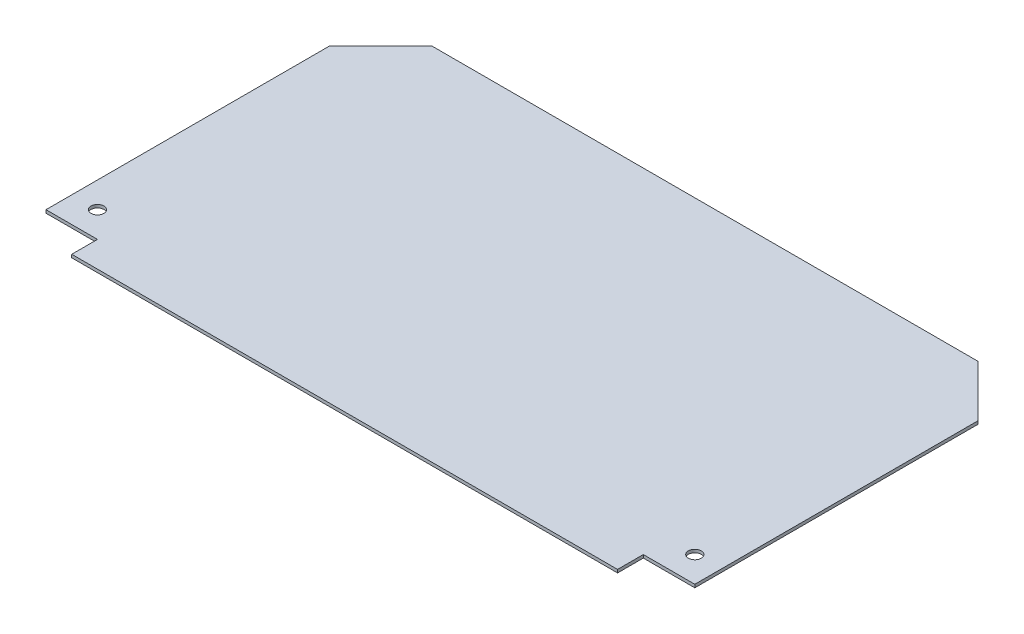
ISO-10303-21;
HEADER;
FILE_DESCRIPTION(('STEP AP214'),'2;1');
FILE_NAME('part.step','',(''),(''),'','','');
FILE_SCHEMA(('AUTOMOTIVE_DESIGN { 1 0 10303 214 1 1 1 1 }'));
ENDSEC;
DATA;
#1=APPLICATION_CONTEXT('core data for automotive mechanical design processes');
#2=APPLICATION_PROTOCOL_DEFINITION('international standard','automotive_design',2000,#1);
#3=PRODUCT_CONTEXT('',#1,'mechanical');
#4=PRODUCT('Part','Part','',(#3));
#5=PRODUCT_RELATED_PRODUCT_CATEGORY('part','',(#4));
#6=PRODUCT_DEFINITION_FORMATION('','',#4);
#7=PRODUCT_DEFINITION_CONTEXT('part definition',#1,'design');
#8=PRODUCT_DEFINITION('design','',#6,#7);
#9=PRODUCT_DEFINITION_SHAPE('','',#8);
#10=(LENGTH_UNIT() NAMED_UNIT(*) SI_UNIT(.MILLI.,.METRE.));
#11=(NAMED_UNIT(*) PLANE_ANGLE_UNIT() SI_UNIT($,.RADIAN.));
#12=(NAMED_UNIT(*) SI_UNIT($,.STERADIAN.) SOLID_ANGLE_UNIT());
#13=UNCERTAINTY_MEASURE_WITH_UNIT(LENGTH_MEASURE(1.E-05),#10,'distance_accuracy_value','');
#14=(GEOMETRIC_REPRESENTATION_CONTEXT(3) GLOBAL_UNCERTAINTY_ASSIGNED_CONTEXT((#13)) GLOBAL_UNIT_ASSIGNED_CONTEXT((#10,
#11,#12)) REPRESENTATION_CONTEXT('',''));
#15=CARTESIAN_POINT('',(0.,0.,0.));
#16=DIRECTION('',(0.,0.,1.));
#17=DIRECTION('',(1.,0.,0.));
#18=AXIS2_PLACEMENT_3D('',#15,#16,#17);
#19=CARTESIAN_POINT('',(-126.,-1.2,-110.));
#20=DIRECTION('',(-1.,0.,0.));
#21=DIRECTION('',(0.,0.,1.));
#22=AXIS2_PLACEMENT_3D('',#19,#20,#21);
#23=PLANE('',#22);
#24=DIRECTION('',(0.,0.,1.));
#25=VECTOR('',#24,1.);
#26=CARTESIAN_POINT('',(-126.,0.,-110.));
#27=LINE('',#26,#25);
#28=CARTESIAN_POINT('',(-126.,0.,-110.));
#29=VERTEX_POINT('',#28);
#30=CARTESIAN_POINT('',(-126.,0.,0.));
#31=VERTEX_POINT('',#30);
#32=EDGE_CURVE('E137',#29,#31,#27,.T.);
#33=ORIENTED_EDGE('',*,*,#32,.F.);
#34=DIRECTION('',(0.,1.,0.));
#35=VECTOR('',#34,1.);
#36=CARTESIAN_POINT('',(-126.,-1.2,-110.));
#37=LINE('',#36,#35);
#38=CARTESIAN_POINT('',(-126.,-1.2,-110.));
#39=VERTEX_POINT('',#38);
#40=EDGE_CURVE('E11',#39,#29,#37,.T.);
#41=ORIENTED_EDGE('',*,*,#40,.F.);
#42=DIRECTION('',(0.,0.,1.));
#43=VECTOR('',#42,1.);
#44=CARTESIAN_POINT('',(-126.,-1.2,-110.));
#45=LINE('',#44,#43);
#46=CARTESIAN_POINT('',(-126.,-1.2,0.));
#47=VERTEX_POINT('',#46);
#48=EDGE_CURVE('E130',#39,#47,#45,.T.);
#49=ORIENTED_EDGE('',*,*,#48,.T.);
#50=DIRECTION('',(0.,1.,0.));
#51=VECTOR('',#50,1.);
#52=CARTESIAN_POINT('',(-126.,-1.2,0.));
#53=LINE('',#52,#51);
#54=EDGE_CURVE('E46',#47,#31,#53,.T.);
#55=ORIENTED_EDGE('',*,*,#54,.T.);
#56=EDGE_LOOP('',(#33,#41,#49,#55));
#57=FACE_BOUND('',#56,.T.);
#58=ADVANCED_FACE('F43',(#57),#23,.T.);
#59=CARTESIAN_POINT('',(-106.,-1.2,-130.));
#60=DIRECTION('',(-0.707106781186549,0.,-0.707106781186546));
#61=DIRECTION('',(-0.707106781186546,0.,0.707106781186549));
#62=AXIS2_PLACEMENT_3D('',#59,#60,#61);
#63=PLANE('',#62);
#64=DIRECTION('',(-0.707106781186546,0.,0.707106781186549));
#65=VECTOR('',#64,1.);
#66=CARTESIAN_POINT('',(-106.,0.,-130.));
#67=LINE('',#66,#65);
#68=CARTESIAN_POINT('',(-106.,0.,-130.));
#69=VERTEX_POINT('',#68);
#70=EDGE_CURVE('E149',#69,#29,#67,.T.);
#71=ORIENTED_EDGE('',*,*,#70,.F.);
#72=DIRECTION('',(0.,1.,0.));
#73=VECTOR('',#72,1.);
#74=CARTESIAN_POINT('',(-106.,-1.2,-130.));
#75=LINE('',#74,#73);
#76=CARTESIAN_POINT('',(-106.,-1.2,-130.));
#77=VERTEX_POINT('',#76);
#78=EDGE_CURVE('E52',#77,#69,#75,.T.);
#79=ORIENTED_EDGE('',*,*,#78,.F.);
#80=DIRECTION('',(-0.707106781186546,0.,0.707106781186549));
#81=VECTOR('',#80,1.);
#82=CARTESIAN_POINT('',(-106.,-1.2,-130.));
#83=LINE('',#82,#81);
#84=EDGE_CURVE('E135',#77,#39,#83,.T.);
#85=ORIENTED_EDGE('',*,*,#84,.T.);
#86=ORIENTED_EDGE('',*,*,#40,.T.);
#87=EDGE_LOOP('',(#71,#79,#85,#86));
#88=FACE_BOUND('',#87,.T.);
#89=ADVANCED_FACE('F157',(#88),#63,.T.);
#90=CARTESIAN_POINT('',(0.,-1.2,-130.));
#91=DIRECTION('',(0.,0.,-1.));
#92=DIRECTION('',(-1.,0.,0.));
#93=AXIS2_PLACEMENT_3D('',#90,#91,#92);
#94=PLANE('',#93);
#95=DIRECTION('',(-1.,0.,0.));
#96=VECTOR('',#95,1.);
#97=CARTESIAN_POINT('',(0.,0.,-130.));
#98=LINE('',#97,#96);
#99=CARTESIAN_POINT('',(106.,0.,-130.));
#100=VERTEX_POINT('',#99);
#101=EDGE_CURVE('E147',#100,#69,#98,.T.);
#102=ORIENTED_EDGE('',*,*,#101,.F.);
#103=DIRECTION('',(0.,1.,0.));
#104=VECTOR('',#103,1.);
#105=CARTESIAN_POINT('',(106.,-1.2,-130.));
#106=LINE('',#105,#104);
#107=CARTESIAN_POINT('',(106.,-1.2,-130.));
#108=VERTEX_POINT('',#107);
#109=EDGE_CURVE('E164',#108,#100,#106,.T.);
#110=ORIENTED_EDGE('',*,*,#109,.F.);
#111=DIRECTION('',(-1.,0.,0.));
#112=VECTOR('',#111,1.);
#113=CARTESIAN_POINT('',(0.,-1.2,-130.));
#114=LINE('',#113,#112);
#115=EDGE_CURVE('E125',#108,#77,#114,.T.);
#116=ORIENTED_EDGE('',*,*,#115,.T.);
#117=ORIENTED_EDGE('',*,*,#78,.T.);
#118=EDGE_LOOP('',(#102,#110,#116,#117));
#119=FACE_BOUND('',#118,.T.);
#120=ADVANCED_FACE('F161',(#119),#94,.T.);
#121=CARTESIAN_POINT('',(-106.,-1.2,10.));
#122=DIRECTION('',(0.,0.,1.));
#123=DIRECTION('',(1.,0.,0.));
#124=AXIS2_PLACEMENT_3D('',#121,#122,#123);
#125=PLANE('',#124);
#126=DIRECTION('',(1.,0.,0.));
#127=VECTOR('',#126,1.);
#128=CARTESIAN_POINT('',(-106.,0.,10.));
#129=LINE('',#128,#127);
#130=CARTESIAN_POINT('',(-106.,0.,10.));
#131=VERTEX_POINT('',#130);
#132=CARTESIAN_POINT('',(106.,0.,10.));
#133=VERTEX_POINT('',#132);
#134=EDGE_CURVE('E109',#131,#133,#129,.T.);
#135=ORIENTED_EDGE('',*,*,#134,.F.);
#136=DIRECTION('',(0.,1.,0.));
#137=VECTOR('',#136,1.);
#138=CARTESIAN_POINT('',(-106.,-1.2,10.));
#139=LINE('',#138,#137);
#140=CARTESIAN_POINT('',(-106.,-1.2,10.));
#141=VERTEX_POINT('',#140);
#142=EDGE_CURVE('E101',#141,#131,#139,.T.);
#143=ORIENTED_EDGE('',*,*,#142,.F.);
#144=DIRECTION('',(1.,0.,0.));
#145=VECTOR('',#144,1.);
#146=CARTESIAN_POINT('',(-106.,-1.2,10.));
#147=LINE('',#146,#145);
#148=CARTESIAN_POINT('',(106.,-1.2,10.));
#149=VERTEX_POINT('',#148);
#150=EDGE_CURVE('E106',#141,#149,#147,.T.);
#151=ORIENTED_EDGE('',*,*,#150,.T.);
#152=DIRECTION('',(0.,1.,0.));
#153=VECTOR('',#152,1.);
#154=CARTESIAN_POINT('',(106.,-1.2,10.));
#155=LINE('',#154,#153);
#156=EDGE_CURVE('E181',#149,#133,#155,.T.);
#157=ORIENTED_EDGE('',*,*,#156,.T.);
#158=EDGE_LOOP('',(#135,#143,#151,#157));
#159=FACE_BOUND('',#158,.T.);
#160=ADVANCED_FACE('F103',(#159),#125,.T.);
#161=CARTESIAN_POINT('',(-106.,-1.2,0.));
#162=DIRECTION('',(-1.,0.,0.));
#163=DIRECTION('',(0.,0.,1.));
#164=AXIS2_PLACEMENT_3D('',#161,#162,#163);
#165=PLANE('',#164);
#166=DIRECTION('',(0.,0.,1.));
#167=VECTOR('',#166,1.);
#168=CARTESIAN_POINT('',(-106.,0.,0.));
#169=LINE('',#168,#167);
#170=CARTESIAN_POINT('',(-106.,0.,0.));
#171=VERTEX_POINT('',#170);
#172=EDGE_CURVE('E144',#171,#131,#169,.T.);
#173=ORIENTED_EDGE('',*,*,#172,.F.);
#174=DIRECTION('',(0.,1.,0.));
#175=VECTOR('',#174,1.);
#176=CARTESIAN_POINT('',(-106.,-1.2,0.));
#177=LINE('',#176,#175);
#178=CARTESIAN_POINT('',(-106.,-1.2,0.));
#179=VERTEX_POINT('',#178);
#180=EDGE_CURVE('E114',#179,#171,#177,.T.);
#181=ORIENTED_EDGE('',*,*,#180,.F.);
#182=DIRECTION('',(0.,0.,1.));
#183=VECTOR('',#182,1.);
#184=CARTESIAN_POINT('',(-106.,-1.2,0.));
#185=LINE('',#184,#183);
#186=EDGE_CURVE('E120',#179,#141,#185,.T.);
#187=ORIENTED_EDGE('',*,*,#186,.T.);
#188=ORIENTED_EDGE('',*,*,#142,.T.);
#189=EDGE_LOOP('',(#173,#181,#187,#188));
#190=FACE_BOUND('',#189,.T.);
#191=ADVANCED_FACE('F127',(#190),#165,.T.);
#192=CARTESIAN_POINT('',(-126.,-1.2,0.));
#193=DIRECTION('',(0.,0.,1.));
#194=DIRECTION('',(1.,0.,0.));
#195=AXIS2_PLACEMENT_3D('',#192,#193,#194);
#196=PLANE('',#195);
#197=DIRECTION('',(1.,0.,0.));
#198=VECTOR('',#197,1.);
#199=CARTESIAN_POINT('',(-126.,0.,0.));
#200=LINE('',#199,#198);
#201=EDGE_CURVE('E140',#31,#171,#200,.T.);
#202=ORIENTED_EDGE('',*,*,#201,.F.);
#203=ORIENTED_EDGE('',*,*,#54,.F.);
#204=DIRECTION('',(1.,0.,0.));
#205=VECTOR('',#204,1.);
#206=CARTESIAN_POINT('',(-126.,-1.2,0.));
#207=LINE('',#206,#205);
#208=EDGE_CURVE('E128',#47,#179,#207,.T.);
#209=ORIENTED_EDGE('',*,*,#208,.T.);
#210=ORIENTED_EDGE('',*,*,#180,.T.);
#211=EDGE_LOOP('',(#202,#203,#209,#210));
#212=FACE_BOUND('',#211,.T.);
#213=ADVANCED_FACE('F152',(#212),#196,.T.);
#214=CARTESIAN_POINT('',(0.,-1.2,0.));
#215=DIRECTION('',(0.,1.,0.));
#216=DIRECTION('',(0.,0.,1.));
#217=AXIS2_PLACEMENT_3D('',#214,#215,#216);
#218=PLANE('',#217);
#219=CARTESIAN_POINT('',(-116.,-1.2,-10.));
#220=DIRECTION('',(0.,1.,0.));
#221=DIRECTION('',(0.,0.,1.));
#222=AXIS2_PLACEMENT_3D('',#219,#220,#221);
#223=CIRCLE('',#222,2.50000000000001);
#224=CARTESIAN_POINT('',(-116.,-1.2,-7.49999999999999));
#225=VERTEX_POINT('',#224);
#226=EDGE_CURVE('E141',#225,#225,#223,.T.);
#227=ORIENTED_EDGE('',*,*,#226,.T.);
#228=EDGE_LOOP('',(#227));
#229=FACE_BOUND('',#228,.T.);
#230=ORIENTED_EDGE('',*,*,#48,.F.);
#231=ORIENTED_EDGE('',*,*,#84,.F.);
#232=ORIENTED_EDGE('',*,*,#115,.F.);
#233=DIRECTION('',(0.707106781186546,0.,0.707106781186549));
#234=VECTOR('',#233,1.);
#235=CARTESIAN_POINT('',(106.,-1.2,-130.));
#236=LINE('',#235,#234);
#237=CARTESIAN_POINT('',(126.,-1.2,-110.));
#238=VERTEX_POINT('',#237);
#239=EDGE_CURVE('E178',#108,#238,#236,.T.);
#240=ORIENTED_EDGE('',*,*,#239,.T.);
#241=DIRECTION('',(0.,0.,1.));
#242=VECTOR('',#241,1.);
#243=CARTESIAN_POINT('',(126.,-1.2,-110.));
#244=LINE('',#243,#242);
#245=CARTESIAN_POINT('',(126.,-1.2,0.));
#246=VERTEX_POINT('',#245);
#247=EDGE_CURVE('E189',#238,#246,#244,.T.);
#248=ORIENTED_EDGE('',*,*,#247,.T.);
#249=DIRECTION('',(-1.,0.,0.));
#250=VECTOR('',#249,1.);
#251=CARTESIAN_POINT('',(126.,-1.2,0.));
#252=LINE('',#251,#250);
#253=CARTESIAN_POINT('',(106.,-1.2,0.));
#254=VERTEX_POINT('',#253);
#255=EDGE_CURVE('E202',#246,#254,#252,.T.);
#256=ORIENTED_EDGE('',*,*,#255,.T.);
#257=DIRECTION('',(0.,0.,1.));
#258=VECTOR('',#257,1.);
#259=CARTESIAN_POINT('',(106.,-1.2,0.));
#260=LINE('',#259,#258);
#261=EDGE_CURVE('E123',#254,#149,#260,.T.);
#262=ORIENTED_EDGE('',*,*,#261,.T.);
#263=ORIENTED_EDGE('',*,*,#150,.F.);
#264=ORIENTED_EDGE('',*,*,#186,.F.);
#265=ORIENTED_EDGE('',*,*,#208,.F.);
#266=EDGE_LOOP('',(#230,#231,#232,#240,#248,#256,#262,#263,#264,#265));
#267=FACE_BOUND('',#266,.T.);
#268=CARTESIAN_POINT('',(116.,-1.2,-10.));
#269=DIRECTION('',(0.,-1.,0.));
#270=DIRECTION('',(0.,0.,1.));
#271=AXIS2_PLACEMENT_3D('',#268,#269,#270);
#272=CIRCLE('',#271,2.50000000000001);
#273=CARTESIAN_POINT('',(116.,-1.2,-7.49999999999999));
#274=VERTEX_POINT('',#273);
#275=EDGE_CURVE('E199',#274,#274,#272,.T.);
#276=ORIENTED_EDGE('',*,*,#275,.F.);
#277=EDGE_LOOP('',(#276));
#278=FACE_BOUND('',#277,.T.);
#279=ADVANCED_FACE('F118',(#229,#267,#278),#218,.F.);
#280=CARTESIAN_POINT('',(0.,0.,0.));
#281=DIRECTION('',(0.,1.,0.));
#282=DIRECTION('',(0.,0.,1.));
#283=AXIS2_PLACEMENT_3D('',#280,#281,#282);
#284=PLANE('',#283);
#285=CARTESIAN_POINT('',(-116.,0.,-10.));
#286=DIRECTION('',(0.,1.,0.));
#287=DIRECTION('',(0.,0.,1.));
#288=AXIS2_PLACEMENT_3D('',#285,#286,#287);
#289=CIRCLE('',#288,2.50000000000001);
#290=CARTESIAN_POINT('',(-116.,0.,-7.49999999999999));
#291=VERTEX_POINT('',#290);
#292=EDGE_CURVE('E168',#291,#291,#289,.T.);
#293=ORIENTED_EDGE('',*,*,#292,.F.);
#294=EDGE_LOOP('',(#293));
#295=FACE_BOUND('',#294,.T.);
#296=ORIENTED_EDGE('',*,*,#32,.T.);
#297=ORIENTED_EDGE('',*,*,#201,.T.);
#298=ORIENTED_EDGE('',*,*,#172,.T.);
#299=ORIENTED_EDGE('',*,*,#134,.T.);
#300=DIRECTION('',(0.,0.,1.));
#301=VECTOR('',#300,1.);
#302=CARTESIAN_POINT('',(106.,0.,0.));
#303=LINE('',#302,#301);
#304=CARTESIAN_POINT('',(106.,0.,0.));
#305=VERTEX_POINT('',#304);
#306=EDGE_CURVE('E190',#305,#133,#303,.T.);
#307=ORIENTED_EDGE('',*,*,#306,.F.);
#308=DIRECTION('',(-1.,0.,0.));
#309=VECTOR('',#308,1.);
#310=CARTESIAN_POINT('',(126.,0.,0.));
#311=LINE('',#310,#309);
#312=CARTESIAN_POINT('',(126.,0.,0.));
#313=VERTEX_POINT('',#312);
#314=EDGE_CURVE('E193',#313,#305,#311,.T.);
#315=ORIENTED_EDGE('',*,*,#314,.F.);
#316=DIRECTION('',(0.,0.,1.));
#317=VECTOR('',#316,1.);
#318=CARTESIAN_POINT('',(126.,0.,-110.));
#319=LINE('',#318,#317);
#320=CARTESIAN_POINT('',(126.,0.,-110.));
#321=VERTEX_POINT('',#320);
#322=EDGE_CURVE('E196',#321,#313,#319,.T.);
#323=ORIENTED_EDGE('',*,*,#322,.F.);
#324=DIRECTION('',(0.707106781186546,0.,0.707106781186549));
#325=VECTOR('',#324,1.);
#326=CARTESIAN_POINT('',(106.,0.,-130.));
#327=LINE('',#326,#325);
#328=EDGE_CURVE('E186',#100,#321,#327,.T.);
#329=ORIENTED_EDGE('',*,*,#328,.F.);
#330=ORIENTED_EDGE('',*,*,#101,.T.);
#331=ORIENTED_EDGE('',*,*,#70,.T.);
#332=EDGE_LOOP('',(#296,#297,#298,#299,#307,#315,#323,#329,#330,#331));
#333=FACE_BOUND('',#332,.T.);
#334=CARTESIAN_POINT('',(116.,0.,-10.));
#335=DIRECTION('',(0.,-1.,0.));
#336=DIRECTION('',(0.,0.,1.));
#337=AXIS2_PLACEMENT_3D('',#334,#335,#336);
#338=CIRCLE('',#337,2.50000000000001);
#339=CARTESIAN_POINT('',(116.,0.,-7.49999999999999));
#340=VERTEX_POINT('',#339);
#341=EDGE_CURVE('E206',#340,#340,#338,.T.);
#342=ORIENTED_EDGE('',*,*,#341,.T.);
#343=EDGE_LOOP('',(#342));
#344=FACE_BOUND('',#343,.T.);
#345=ADVANCED_FACE('F154',(#295,#333,#344),#284,.T.);
#346=CARTESIAN_POINT('',(-116.,-1.2,-10.));
#347=DIRECTION('',(0.,1.,0.));
#348=DIRECTION('',(0.,0.,1.));
#349=AXIS2_PLACEMENT_3D('',#346,#347,#348);
#350=CYLINDRICAL_SURFACE('',#349,2.50000000000001);
#351=ORIENTED_EDGE('',*,*,#226,.F.);
#352=EDGE_LOOP('',(#351));
#353=FACE_BOUND('',#352,.T.);
#354=ORIENTED_EDGE('',*,*,#292,.T.);
#355=EDGE_LOOP('',(#354));
#356=FACE_BOUND('',#355,.T.);
#357=ADVANCED_FACE('F221',(#353,#356),#350,.F.);
#358=CARTESIAN_POINT('',(126.,-1.2,-110.));
#359=DIRECTION('',(1.,0.,0.));
#360=DIRECTION('',(0.,0.,1.));
#361=AXIS2_PLACEMENT_3D('',#358,#359,#360);
#362=PLANE('',#361);
#363=ORIENTED_EDGE('',*,*,#322,.T.);
#364=DIRECTION('',(0.,1.,0.));
#365=VECTOR('',#364,1.);
#366=CARTESIAN_POINT('',(126.,-1.2,0.));
#367=LINE('',#366,#365);
#368=EDGE_CURVE('E174',#246,#313,#367,.T.);
#369=ORIENTED_EDGE('',*,*,#368,.F.);
#370=ORIENTED_EDGE('',*,*,#247,.F.);
#371=DIRECTION('',(0.,1.,0.));
#372=VECTOR('',#371,1.);
#373=CARTESIAN_POINT('',(126.,-1.2,-110.));
#374=LINE('',#373,#372);
#375=EDGE_CURVE('E171',#238,#321,#374,.T.);
#376=ORIENTED_EDGE('',*,*,#375,.T.);
#377=EDGE_LOOP('',(#363,#369,#370,#376));
#378=FACE_BOUND('',#377,.T.);
#379=ADVANCED_FACE('F271',(#378),#362,.T.);
#380=CARTESIAN_POINT('',(106.,-1.2,-130.));
#381=DIRECTION('',(0.707106781186549,0.,-0.707106781186546));
#382=DIRECTION('',(0.707106781186546,0.,0.707106781186549));
#383=AXIS2_PLACEMENT_3D('',#380,#381,#382);
#384=PLANE('',#383);
#385=ORIENTED_EDGE('',*,*,#328,.T.);
#386=ORIENTED_EDGE('',*,*,#375,.F.);
#387=ORIENTED_EDGE('',*,*,#239,.F.);
#388=ORIENTED_EDGE('',*,*,#109,.T.);
#389=EDGE_LOOP('',(#385,#386,#387,#388));
#390=FACE_BOUND('',#389,.T.);
#391=ADVANCED_FACE('F279',(#390),#384,.T.);
#392=CARTESIAN_POINT('',(106.,-1.2,0.));
#393=DIRECTION('',(1.,0.,0.));
#394=DIRECTION('',(0.,0.,1.));
#395=AXIS2_PLACEMENT_3D('',#392,#393,#394);
#396=PLANE('',#395);
#397=ORIENTED_EDGE('',*,*,#306,.T.);
#398=ORIENTED_EDGE('',*,*,#156,.F.);
#399=ORIENTED_EDGE('',*,*,#261,.F.);
#400=DIRECTION('',(0.,1.,0.));
#401=VECTOR('',#400,1.);
#402=CARTESIAN_POINT('',(106.,-1.2,0.));
#403=LINE('',#402,#401);
#404=EDGE_CURVE('E177',#254,#305,#403,.T.);
#405=ORIENTED_EDGE('',*,*,#404,.T.);
#406=EDGE_LOOP('',(#397,#398,#399,#405));
#407=FACE_BOUND('',#406,.T.);
#408=ADVANCED_FACE('F290',(#407),#396,.T.);
#409=CARTESIAN_POINT('',(126.,-1.2,0.));
#410=DIRECTION('',(0.,0.,1.));
#411=DIRECTION('',(-1.,0.,0.));
#412=AXIS2_PLACEMENT_3D('',#409,#410,#411);
#413=PLANE('',#412);
#414=ORIENTED_EDGE('',*,*,#314,.T.);
#415=ORIENTED_EDGE('',*,*,#404,.F.);
#416=ORIENTED_EDGE('',*,*,#255,.F.);
#417=ORIENTED_EDGE('',*,*,#368,.T.);
#418=EDGE_LOOP('',(#414,#415,#416,#417));
#419=FACE_BOUND('',#418,.T.);
#420=ADVANCED_FACE('F301',(#419),#413,.T.);
#421=CARTESIAN_POINT('',(116.,-1.2,-10.));
#422=DIRECTION('',(0.,1.,0.));
#423=DIRECTION('',(0.,0.,1.));
#424=AXIS2_PLACEMENT_3D('',#421,#422,#423);
#425=CYLINDRICAL_SURFACE('',#424,2.50000000000001);
#426=ORIENTED_EDGE('',*,*,#275,.T.);
#427=EDGE_LOOP('',(#426));
#428=FACE_BOUND('',#427,.T.);
#429=ORIENTED_EDGE('',*,*,#341,.F.);
#430=EDGE_LOOP('',(#429));
#431=FACE_BOUND('',#430,.T.);
#432=ADVANCED_FACE('F212',(#428,#431),#425,.F.);
#433=CLOSED_SHELL('',(#58,#89,#120,#160,#191,#213,#279,#345,#357,#379,#391,#408,#420,#432));
#434=MANIFOLD_SOLID_BREP('B2',#433);
#435=ADVANCED_BREP_SHAPE_REPRESENTATION('',(#18,#434),#14);
#436=SHAPE_DEFINITION_REPRESENTATION(#9,#435);
ENDSEC;
END-ISO-10303-21;
